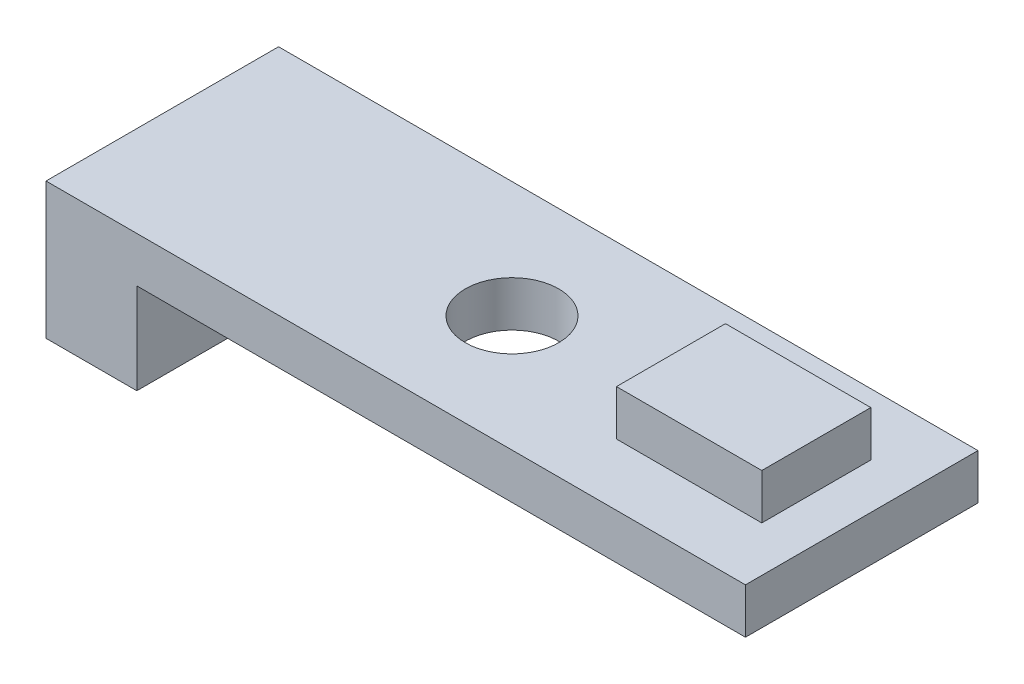
ISO-10303-21;
HEADER;
FILE_DESCRIPTION(('STEP AP214'),'2;1');
FILE_NAME('part.step','',(''),(''),'','','');
FILE_SCHEMA(('AUTOMOTIVE_DESIGN { 1 0 10303 214 1 1 1 1 }'));
ENDSEC;
DATA;
#1=APPLICATION_CONTEXT('core data for automotive mechanical design processes');
#2=APPLICATION_PROTOCOL_DEFINITION('international standard','automotive_design',2000,#1);
#3=PRODUCT_CONTEXT('',#1,'mechanical');
#4=PRODUCT('Part','Part','',(#3));
#5=PRODUCT_RELATED_PRODUCT_CATEGORY('part','',(#4));
#6=PRODUCT_DEFINITION_FORMATION('','',#4);
#7=PRODUCT_DEFINITION_CONTEXT('part definition',#1,'design');
#8=PRODUCT_DEFINITION('design','',#6,#7);
#9=PRODUCT_DEFINITION_SHAPE('','',#8);
#10=(LENGTH_UNIT() NAMED_UNIT(*) SI_UNIT(.MILLI.,.METRE.));
#11=(NAMED_UNIT(*) PLANE_ANGLE_UNIT() SI_UNIT($,.RADIAN.));
#12=(NAMED_UNIT(*) SI_UNIT($,.STERADIAN.) SOLID_ANGLE_UNIT());
#13=UNCERTAINTY_MEASURE_WITH_UNIT(LENGTH_MEASURE(1.E-05),#10,'distance_accuracy_value','');
#14=(GEOMETRIC_REPRESENTATION_CONTEXT(3) GLOBAL_UNCERTAINTY_ASSIGNED_CONTEXT((#13)) GLOBAL_UNIT_ASSIGNED_CONTEXT((#10,
#11,#12)) REPRESENTATION_CONTEXT('',''));
#15=CARTESIAN_POINT('',(0.,0.,0.));
#16=DIRECTION('',(0.,0.,1.));
#17=DIRECTION('',(1.,0.,0.));
#18=AXIS2_PLACEMENT_3D('',#15,#16,#17);
#19=CARTESIAN_POINT('',(0.,1.5875,0.));
#20=DIRECTION('',(0.,-1.,0.));
#21=DIRECTION('',(0.,0.,-1.));
#22=AXIS2_PLACEMENT_3D('',#19,#20,#21);
#23=PLANE('',#22);
#24=CARTESIAN_POINT('',(0.,1.5875,0.));
#25=DIRECTION('',(0.,1.,0.));
#26=DIRECTION('',(0.,0.,1.));
#27=AXIS2_PLACEMENT_3D('',#24,#25,#26);
#28=CIRCLE('',#27,1.63195);
#29=CARTESIAN_POINT('',(0.,1.5875,1.63195));
#30=VERTEX_POINT('',#29);
#31=EDGE_CURVE('E174',#30,#30,#28,.T.);
#32=ORIENTED_EDGE('',*,*,#31,.F.);
#33=EDGE_LOOP('',(#32));
#34=FACE_BOUND('',#33,.T.);
#35=DIRECTION('',(0.,0.,-1.));
#36=VECTOR('',#35,1.);
#37=CARTESIAN_POINT('',(12.22375,1.5875,4.064));
#38=LINE('',#37,#36);
#39=CARTESIAN_POINT('',(12.22375,1.5875,4.064));
#40=VERTEX_POINT('',#39);
#41=CARTESIAN_POINT('',(12.22375,1.5875,-4.064));
#42=VERTEX_POINT('',#41);
#43=EDGE_CURVE('E180',#40,#42,#38,.T.);
#44=ORIENTED_EDGE('',*,*,#43,.T.);
#45=DIRECTION('',(-1.,0.,0.));
#46=VECTOR('',#45,1.);
#47=CARTESIAN_POINT('',(-12.22375,1.5875,-4.064));
#48=LINE('',#47,#46);
#49=CARTESIAN_POINT('',(-12.22375,1.5875,-4.064));
#50=VERTEX_POINT('',#49);
#51=EDGE_CURVE('E183',#42,#50,#48,.T.);
#52=ORIENTED_EDGE('',*,*,#51,.T.);
#53=DIRECTION('',(0.,0.,1.));
#54=VECTOR('',#53,1.);
#55=CARTESIAN_POINT('',(-12.22375,1.5875,4.064));
#56=LINE('',#55,#54);
#57=CARTESIAN_POINT('',(-12.22375,1.5875,4.064));
#58=VERTEX_POINT('',#57);
#59=EDGE_CURVE('E118',#50,#58,#56,.T.);
#60=ORIENTED_EDGE('',*,*,#59,.T.);
#61=DIRECTION('',(1.,0.,0.));
#62=VECTOR('',#61,1.);
#63=CARTESIAN_POINT('',(-12.22375,1.5875,4.064));
#64=LINE('',#63,#62);
#65=EDGE_CURVE('E187',#58,#40,#64,.T.);
#66=ORIENTED_EDGE('',*,*,#65,.T.);
#67=EDGE_LOOP('',(#44,#52,#60,#66));
#68=FACE_BOUND('',#67,.T.);
#69=DIRECTION('',(0.,0.,-1.));
#70=VECTOR('',#69,1.);
#71=CARTESIAN_POINT('',(10.63625,1.5875,1.905));
#72=LINE('',#71,#70);
#73=CARTESIAN_POINT('',(10.63625,1.5875,1.905));
#74=VERTEX_POINT('',#73);
#75=CARTESIAN_POINT('',(10.63625,1.5875,-1.905));
#76=VERTEX_POINT('',#75);
#77=EDGE_CURVE('E58',#74,#76,#72,.T.);
#78=ORIENTED_EDGE('',*,*,#77,.F.);
#79=DIRECTION('',(1.,0.,0.));
#80=VECTOR('',#79,1.);
#81=CARTESIAN_POINT('',(5.55625,1.5875,1.905));
#82=LINE('',#81,#80);
#83=CARTESIAN_POINT('',(5.55625,1.5875,1.905));
#84=VERTEX_POINT('',#83);
#85=EDGE_CURVE('E147',#84,#74,#82,.T.);
#86=ORIENTED_EDGE('',*,*,#85,.F.);
#87=DIRECTION('',(0.,0.,1.));
#88=VECTOR('',#87,1.);
#89=CARTESIAN_POINT('',(5.55625,1.5875,1.905));
#90=LINE('',#89,#88);
#91=CARTESIAN_POINT('',(5.55625,1.5875,-1.905));
#92=VERTEX_POINT('',#91);
#93=EDGE_CURVE('E158',#92,#84,#90,.T.);
#94=ORIENTED_EDGE('',*,*,#93,.F.);
#95=DIRECTION('',(-1.,0.,0.));
#96=VECTOR('',#95,1.);
#97=CARTESIAN_POINT('',(5.55625,1.5875,-1.905));
#98=LINE('',#97,#96);
#99=EDGE_CURVE('E155',#76,#92,#98,.T.);
#100=ORIENTED_EDGE('',*,*,#99,.F.);
#101=EDGE_LOOP('',(#78,#86,#94,#100));
#102=FACE_BOUND('',#101,.T.);
#103=ADVANCED_FACE('F35',(#34,#68,#102),#23,.F.);
#104=CARTESIAN_POINT('',(0.,0.,0.));
#105=DIRECTION('',(0.,-1.,0.));
#106=DIRECTION('',(0.,0.,-1.));
#107=AXIS2_PLACEMENT_3D('',#104,#105,#106);
#108=PLANE('',#107);
#109=DIRECTION('',(0.,0.,1.));
#110=VECTOR('',#109,1.);
#111=CARTESIAN_POINT('',(-9.04875000000001,0.,4.064));
#112=LINE('',#111,#110);
#113=CARTESIAN_POINT('',(-9.04875000000001,0.,-4.064));
#114=VERTEX_POINT('',#113);
#115=CARTESIAN_POINT('',(-9.04875000000001,0.,4.064));
#116=VERTEX_POINT('',#115);
#117=EDGE_CURVE('E50',#114,#116,#112,.T.);
#118=ORIENTED_EDGE('',*,*,#117,.F.);
#119=DIRECTION('',(-1.,0.,0.));
#120=VECTOR('',#119,1.);
#121=CARTESIAN_POINT('',(-12.22375,0.,-4.064));
#122=LINE('',#121,#120);
#123=CARTESIAN_POINT('',(12.22375,0.,-4.064));
#124=VERTEX_POINT('',#123);
#125=EDGE_CURVE('E192',#124,#114,#122,.T.);
#126=ORIENTED_EDGE('',*,*,#125,.F.);
#127=DIRECTION('',(0.,0.,-1.));
#128=VECTOR('',#127,1.);
#129=CARTESIAN_POINT('',(12.22375,0.,4.064));
#130=LINE('',#129,#128);
#131=CARTESIAN_POINT('',(12.22375,0.,4.064));
#132=VERTEX_POINT('',#131);
#133=EDGE_CURVE('E177',#132,#124,#130,.T.);
#134=ORIENTED_EDGE('',*,*,#133,.F.);
#135=DIRECTION('',(1.,0.,0.));
#136=VECTOR('',#135,1.);
#137=CARTESIAN_POINT('',(-12.22375,0.,4.064));
#138=LINE('',#137,#136);
#139=EDGE_CURVE('E184',#116,#132,#138,.T.);
#140=ORIENTED_EDGE('',*,*,#139,.F.);
#141=EDGE_LOOP('',(#118,#126,#134,#140));
#142=FACE_BOUND('',#141,.T.);
#143=CARTESIAN_POINT('',(0.,0.,0.));
#144=DIRECTION('',(0.,1.,0.));
#145=DIRECTION('',(0.,0.,1.));
#146=AXIS2_PLACEMENT_3D('',#143,#144,#145);
#147=CIRCLE('',#146,1.63195);
#148=CARTESIAN_POINT('',(0.,0.,1.63195));
#149=VERTEX_POINT('',#148);
#150=EDGE_CURVE('E173',#149,#149,#147,.T.);
#151=ORIENTED_EDGE('',*,*,#150,.T.);
#152=EDGE_LOOP('',(#151));
#153=FACE_BOUND('',#152,.T.);
#154=ADVANCED_FACE('F206',(#142,#153),#108,.T.);
#155=CARTESIAN_POINT('',(12.22375,1.5875,4.064));
#156=DIRECTION('',(-1.,0.,0.));
#157=DIRECTION('',(0.,0.,1.));
#158=AXIS2_PLACEMENT_3D('',#155,#156,#157);
#159=PLANE('',#158);
#160=ORIENTED_EDGE('',*,*,#133,.T.);
#161=DIRECTION('',(0.,-1.,0.));
#162=VECTOR('',#161,1.);
#163=CARTESIAN_POINT('',(12.22375,1.5875,-4.064));
#164=LINE('',#163,#162);
#165=EDGE_CURVE('E11',#42,#124,#164,.T.);
#166=ORIENTED_EDGE('',*,*,#165,.F.);
#167=ORIENTED_EDGE('',*,*,#43,.F.);
#168=DIRECTION('',(0.,-1.,0.));
#169=VECTOR('',#168,1.);
#170=CARTESIAN_POINT('',(12.22375,1.5875,4.064));
#171=LINE('',#170,#169);
#172=EDGE_CURVE('E189',#40,#132,#171,.T.);
#173=ORIENTED_EDGE('',*,*,#172,.T.);
#174=EDGE_LOOP('',(#160,#166,#167,#173));
#175=FACE_BOUND('',#174,.T.);
#176=ADVANCED_FACE('F37',(#175),#159,.F.);
#177=CARTESIAN_POINT('',(-12.22375,1.5875,-4.064));
#178=DIRECTION('',(0.,0.,1.));
#179=DIRECTION('',(1.,0.,0.));
#180=AXIS2_PLACEMENT_3D('',#177,#178,#179);
#181=PLANE('',#180);
#182=ORIENTED_EDGE('',*,*,#125,.T.);
#183=DIRECTION('',(0.,1.,0.));
#184=VECTOR('',#183,1.);
#185=CARTESIAN_POINT('',(-9.04875000000001,-3.175,-4.064));
#186=LINE('',#185,#184);
#187=CARTESIAN_POINT('',(-9.04875000000001,-3.175,-4.064));
#188=VERTEX_POINT('',#187);
#189=EDGE_CURVE('E125',#188,#114,#186,.T.);
#190=ORIENTED_EDGE('',*,*,#189,.F.);
#191=DIRECTION('',(1.,0.,0.));
#192=VECTOR('',#191,1.);
#193=CARTESIAN_POINT('',(-12.22375,-3.175,-4.064));
#194=LINE('',#193,#192);
#195=CARTESIAN_POINT('',(-12.22375,-3.175,-4.064));
#196=VERTEX_POINT('',#195);
#197=EDGE_CURVE('E122',#196,#188,#194,.T.);
#198=ORIENTED_EDGE('',*,*,#197,.F.);
#199=DIRECTION('',(0.,-1.,0.));
#200=VECTOR('',#199,1.);
#201=CARTESIAN_POINT('',(-12.22375,1.5875,-4.064));
#202=LINE('',#201,#200);
#203=EDGE_CURVE('E43',#50,#196,#202,.T.);
#204=ORIENTED_EDGE('',*,*,#203,.F.);
#205=ORIENTED_EDGE('',*,*,#51,.F.);
#206=ORIENTED_EDGE('',*,*,#165,.T.);
#207=EDGE_LOOP('',(#182,#190,#198,#204,#205,#206));
#208=FACE_BOUND('',#207,.T.);
#209=ADVANCED_FACE('F123',(#208),#181,.F.);
#210=CARTESIAN_POINT('',(-12.22375,1.5875,4.064));
#211=DIRECTION('',(1.,0.,0.));
#212=DIRECTION('',(0.,0.,-1.));
#213=AXIS2_PLACEMENT_3D('',#210,#211,#212);
#214=PLANE('',#213);
#215=ORIENTED_EDGE('',*,*,#203,.T.);
#216=DIRECTION('',(0.,0.,-1.));
#217=VECTOR('',#216,1.);
#218=CARTESIAN_POINT('',(-12.22375,-3.175,4.064));
#219=LINE('',#218,#217);
#220=CARTESIAN_POINT('',(-12.22375,-3.175,4.064));
#221=VERTEX_POINT('',#220);
#222=EDGE_CURVE('E117',#221,#196,#219,.T.);
#223=ORIENTED_EDGE('',*,*,#222,.F.);
#224=DIRECTION('',(0.,-1.,0.));
#225=VECTOR('',#224,1.);
#226=CARTESIAN_POINT('',(-12.22375,1.5875,4.064));
#227=LINE('',#226,#225);
#228=EDGE_CURVE('E120',#58,#221,#227,.T.);
#229=ORIENTED_EDGE('',*,*,#228,.F.);
#230=ORIENTED_EDGE('',*,*,#59,.F.);
#231=EDGE_LOOP('',(#215,#223,#229,#230));
#232=FACE_BOUND('',#231,.T.);
#233=ADVANCED_FACE('F114',(#232),#214,.F.);
#234=CARTESIAN_POINT('',(-12.22375,1.5875,4.064));
#235=DIRECTION('',(0.,0.,-1.));
#236=DIRECTION('',(-1.,0.,0.));
#237=AXIS2_PLACEMENT_3D('',#234,#235,#236);
#238=PLANE('',#237);
#239=ORIENTED_EDGE('',*,*,#228,.T.);
#240=DIRECTION('',(-1.,0.,0.));
#241=VECTOR('',#240,1.);
#242=CARTESIAN_POINT('',(-12.22375,-3.175,4.064));
#243=LINE('',#242,#241);
#244=CARTESIAN_POINT('',(-9.04875000000001,-3.175,4.064));
#245=VERTEX_POINT('',#244);
#246=EDGE_CURVE('E133',#245,#221,#243,.T.);
#247=ORIENTED_EDGE('',*,*,#246,.F.);
#248=DIRECTION('',(0.,1.,0.));
#249=VECTOR('',#248,1.);
#250=CARTESIAN_POINT('',(-9.04875000000001,-3.175,4.064));
#251=LINE('',#250,#249);
#252=EDGE_CURVE('E138',#245,#116,#251,.T.);
#253=ORIENTED_EDGE('',*,*,#252,.T.);
#254=ORIENTED_EDGE('',*,*,#139,.T.);
#255=ORIENTED_EDGE('',*,*,#172,.F.);
#256=ORIENTED_EDGE('',*,*,#65,.F.);
#257=EDGE_LOOP('',(#239,#247,#253,#254,#255,#256));
#258=FACE_BOUND('',#257,.T.);
#259=ADVANCED_FACE('F199',(#258),#238,.F.);
#260=CARTESIAN_POINT('',(0.,1.5875,0.));
#261=DIRECTION('',(0.,-1.,0.));
#262=DIRECTION('',(0.,0.,-1.));
#263=AXIS2_PLACEMENT_3D('',#260,#261,#262);
#264=CYLINDRICAL_SURFACE('',#263,1.63195);
#265=ORIENTED_EDGE('',*,*,#31,.T.);
#266=EDGE_LOOP('',(#265));
#267=FACE_BOUND('',#266,.T.);
#268=ORIENTED_EDGE('',*,*,#150,.F.);
#269=EDGE_LOOP('',(#268));
#270=FACE_BOUND('',#269,.T.);
#271=ADVANCED_FACE('F231',(#267,#270),#264,.F.);
#272=CARTESIAN_POINT('',(10.63625,3.175,1.905));
#273=DIRECTION('',(-1.,0.,0.));
#274=DIRECTION('',(0.,0.,1.));
#275=AXIS2_PLACEMENT_3D('',#272,#273,#274);
#276=PLANE('',#275);
#277=ORIENTED_EDGE('',*,*,#77,.T.);
#278=DIRECTION('',(0.,-1.,0.));
#279=VECTOR('',#278,1.);
#280=CARTESIAN_POINT('',(10.63625,3.175,-1.905));
#281=LINE('',#280,#279);
#282=CARTESIAN_POINT('',(10.63625,3.175,-1.905));
#283=VERTEX_POINT('',#282);
#284=EDGE_CURVE('E170',#283,#76,#281,.T.);
#285=ORIENTED_EDGE('',*,*,#284,.F.);
#286=DIRECTION('',(0.,0.,-1.));
#287=VECTOR('',#286,1.);
#288=CARTESIAN_POINT('',(10.63625,3.175,1.905));
#289=LINE('',#288,#287);
#290=CARTESIAN_POINT('',(10.63625,3.175,1.905));
#291=VERTEX_POINT('',#290);
#292=EDGE_CURVE('E143',#291,#283,#289,.T.);
#293=ORIENTED_EDGE('',*,*,#292,.F.);
#294=DIRECTION('',(0.,-1.,0.));
#295=VECTOR('',#294,1.);
#296=CARTESIAN_POINT('',(10.63625,3.175,1.905));
#297=LINE('',#296,#295);
#298=EDGE_CURVE('E153',#291,#74,#297,.T.);
#299=ORIENTED_EDGE('',*,*,#298,.T.);
#300=EDGE_LOOP('',(#277,#285,#293,#299));
#301=FACE_BOUND('',#300,.T.);
#302=ADVANCED_FACE('F318',(#301),#276,.F.);
#303=CARTESIAN_POINT('',(5.55625,3.175,-1.905));
#304=DIRECTION('',(0.,0.,1.));
#305=DIRECTION('',(1.,0.,0.));
#306=AXIS2_PLACEMENT_3D('',#303,#304,#305);
#307=PLANE('',#306);
#308=ORIENTED_EDGE('',*,*,#99,.T.);
#309=DIRECTION('',(0.,-1.,0.));
#310=VECTOR('',#309,1.);
#311=CARTESIAN_POINT('',(5.55625,3.175,-1.905));
#312=LINE('',#311,#310);
#313=CARTESIAN_POINT('',(5.55625,3.175,-1.905));
#314=VERTEX_POINT('',#313);
#315=EDGE_CURVE('E167',#314,#92,#312,.T.);
#316=ORIENTED_EDGE('',*,*,#315,.F.);
#317=DIRECTION('',(-1.,0.,0.));
#318=VECTOR('',#317,1.);
#319=CARTESIAN_POINT('',(5.55625,3.175,-1.905));
#320=LINE('',#319,#318);
#321=EDGE_CURVE('E146',#283,#314,#320,.T.);
#322=ORIENTED_EDGE('',*,*,#321,.F.);
#323=ORIENTED_EDGE('',*,*,#284,.T.);
#324=EDGE_LOOP('',(#308,#316,#322,#323));
#325=FACE_BOUND('',#324,.T.);
#326=ADVANCED_FACE('F307',(#325),#307,.F.);
#327=CARTESIAN_POINT('',(5.55625,3.175,1.905));
#328=DIRECTION('',(1.,0.,0.));
#329=DIRECTION('',(0.,0.,-1.));
#330=AXIS2_PLACEMENT_3D('',#327,#328,#329);
#331=PLANE('',#330);
#332=ORIENTED_EDGE('',*,*,#93,.T.);
#333=DIRECTION('',(0.,-1.,0.));
#334=VECTOR('',#333,1.);
#335=CARTESIAN_POINT('',(5.55625,3.175,1.905));
#336=LINE('',#335,#334);
#337=CARTESIAN_POINT('',(5.55625,3.175,1.905));
#338=VERTEX_POINT('',#337);
#339=EDGE_CURVE('E164',#338,#84,#336,.T.);
#340=ORIENTED_EDGE('',*,*,#339,.F.);
#341=DIRECTION('',(0.,0.,1.));
#342=VECTOR('',#341,1.);
#343=CARTESIAN_POINT('',(5.55625,3.175,1.905));
#344=LINE('',#343,#342);
#345=EDGE_CURVE('E149',#314,#338,#344,.T.);
#346=ORIENTED_EDGE('',*,*,#345,.F.);
#347=ORIENTED_EDGE('',*,*,#315,.T.);
#348=EDGE_LOOP('',(#332,#340,#346,#347));
#349=FACE_BOUND('',#348,.T.);
#350=ADVANCED_FACE('F298',(#349),#331,.F.);
#351=CARTESIAN_POINT('',(5.55625,3.175,1.905));
#352=DIRECTION('',(0.,0.,-1.));
#353=DIRECTION('',(-1.,0.,0.));
#354=AXIS2_PLACEMENT_3D('',#351,#352,#353);
#355=PLANE('',#354);
#356=ORIENTED_EDGE('',*,*,#85,.T.);
#357=ORIENTED_EDGE('',*,*,#298,.F.);
#358=DIRECTION('',(1.,0.,0.));
#359=VECTOR('',#358,1.);
#360=CARTESIAN_POINT('',(5.55625,3.175,1.905));
#361=LINE('',#360,#359);
#362=EDGE_CURVE('E151',#338,#291,#361,.T.);
#363=ORIENTED_EDGE('',*,*,#362,.F.);
#364=ORIENTED_EDGE('',*,*,#339,.T.);
#365=EDGE_LOOP('',(#356,#357,#363,#364));
#366=FACE_BOUND('',#365,.T.);
#367=ADVANCED_FACE('F219',(#366),#355,.F.);
#368=CARTESIAN_POINT('',(0.,3.175,0.));
#369=DIRECTION('',(0.,-1.,0.));
#370=DIRECTION('',(0.,0.,-1.));
#371=AXIS2_PLACEMENT_3D('',#368,#369,#370);
#372=PLANE('',#371);
#373=ORIENTED_EDGE('',*,*,#292,.T.);
#374=ORIENTED_EDGE('',*,*,#321,.T.);
#375=ORIENTED_EDGE('',*,*,#345,.T.);
#376=ORIENTED_EDGE('',*,*,#362,.T.);
#377=EDGE_LOOP('',(#373,#374,#375,#376));
#378=FACE_BOUND('',#377,.T.);
#379=ADVANCED_FACE('F212',(#378),#372,.F.);
#380=CARTESIAN_POINT('',(-9.04875000000001,-3.175,4.064));
#381=DIRECTION('',(-1.,0.,0.));
#382=DIRECTION('',(0.,0.,1.));
#383=AXIS2_PLACEMENT_3D('',#380,#381,#382);
#384=PLANE('',#383);
#385=ORIENTED_EDGE('',*,*,#117,.T.);
#386=ORIENTED_EDGE('',*,*,#252,.F.);
#387=DIRECTION('',(0.,0.,1.));
#388=VECTOR('',#387,1.);
#389=CARTESIAN_POINT('',(-9.04875000000001,-3.175,4.064));
#390=LINE('',#389,#388);
#391=EDGE_CURVE('E128',#188,#245,#390,.T.);
#392=ORIENTED_EDGE('',*,*,#391,.F.);
#393=ORIENTED_EDGE('',*,*,#189,.T.);
#394=EDGE_LOOP('',(#385,#386,#392,#393));
#395=FACE_BOUND('',#394,.T.);
#396=ADVANCED_FACE('F210',(#395),#384,.F.);
#397=CARTESIAN_POINT('',(0.,-3.175,0.));
#398=DIRECTION('',(0.,-1.,0.));
#399=DIRECTION('',(0.,0.,-1.));
#400=AXIS2_PLACEMENT_3D('',#397,#398,#399);
#401=PLANE('',#400);
#402=ORIENTED_EDGE('',*,*,#222,.T.);
#403=ORIENTED_EDGE('',*,*,#197,.T.);
#404=ORIENTED_EDGE('',*,*,#391,.T.);
#405=ORIENTED_EDGE('',*,*,#246,.T.);
#406=EDGE_LOOP('',(#402,#403,#404,#405));
#407=FACE_BOUND('',#406,.T.);
#408=ADVANCED_FACE('F131',(#407),#401,.T.);
#409=CLOSED_SHELL('',(#103,#154,#176,#209,#233,#259,#271,#302,#326,#350,#367,#379,#396,#408));
#410=MANIFOLD_SOLID_BREP('B2',#409);
#411=ADVANCED_BREP_SHAPE_REPRESENTATION('',(#18,#410),#14);
#412=SHAPE_DEFINITION_REPRESENTATION(#9,#411);
ENDSEC;
END-ISO-10303-21;
